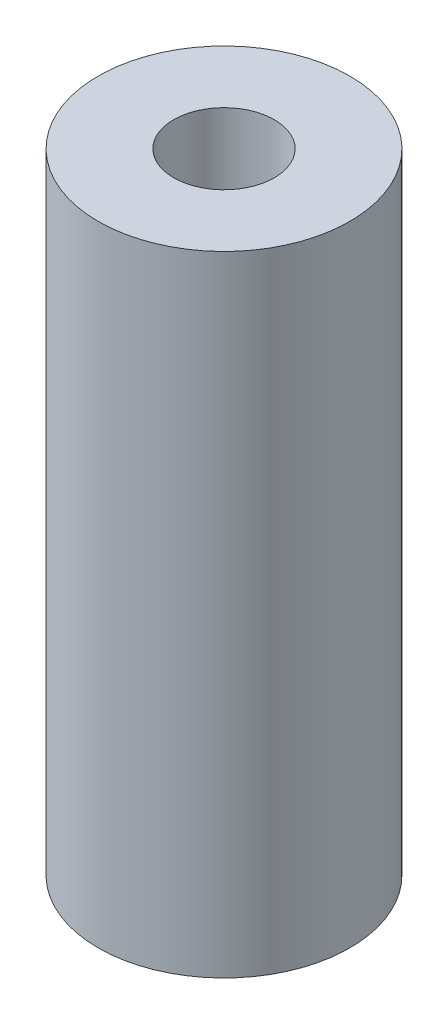
ISO-10303-21;
HEADER;
FILE_DESCRIPTION(('STEP AP214'),'2;1');
FILE_NAME('part.step','',(''),(''),'','','');
FILE_SCHEMA(('AUTOMOTIVE_DESIGN { 1 0 10303 214 1 1 1 1 }'));
ENDSEC;
DATA;
#1=APPLICATION_CONTEXT('core data for automotive mechanical design processes');
#2=APPLICATION_PROTOCOL_DEFINITION('international standard','automotive_design',2000,#1);
#3=PRODUCT_CONTEXT('',#1,'mechanical');
#4=PRODUCT('Part','Part','',(#3));
#5=PRODUCT_RELATED_PRODUCT_CATEGORY('part','',(#4));
#6=PRODUCT_DEFINITION_FORMATION('','',#4);
#7=PRODUCT_DEFINITION_CONTEXT('part definition',#1,'design');
#8=PRODUCT_DEFINITION('design','',#6,#7);
#9=PRODUCT_DEFINITION_SHAPE('','',#8);
#10=(LENGTH_UNIT() NAMED_UNIT(*) SI_UNIT(.MILLI.,.METRE.));
#11=(NAMED_UNIT(*) PLANE_ANGLE_UNIT() SI_UNIT($,.RADIAN.));
#12=(NAMED_UNIT(*) SI_UNIT($,.STERADIAN.) SOLID_ANGLE_UNIT());
#13=UNCERTAINTY_MEASURE_WITH_UNIT(LENGTH_MEASURE(1.E-05),#10,'distance_accuracy_value','');
#14=(GEOMETRIC_REPRESENTATION_CONTEXT(3) GLOBAL_UNCERTAINTY_ASSIGNED_CONTEXT((#13)) GLOBAL_UNIT_ASSIGNED_CONTEXT((#10,
#11,#12)) REPRESENTATION_CONTEXT('',''));
#15=CARTESIAN_POINT('',(0.,0.,0.));
#16=DIRECTION('',(0.,0.,1.));
#17=DIRECTION('',(1.,0.,0.));
#18=AXIS2_PLACEMENT_3D('',#15,#16,#17);
#19=CARTESIAN_POINT('',(0.,12.5,0.));
#20=DIRECTION('',(0.,1.,0.));
#21=DIRECTION('',(0.,0.,1.));
#22=AXIS2_PLACEMENT_3D('',#19,#20,#21);
#23=PLANE('',#22);
#24=CARTESIAN_POINT('',(0.,12.5,0.));
#25=DIRECTION('',(0.,1.,0.));
#26=DIRECTION('',(0.,0.,1.));
#27=AXIS2_PLACEMENT_3D('',#24,#25,#26);
#28=CIRCLE('',#27,2.5);
#29=CARTESIAN_POINT('',(0.,12.5,2.5));
#30=VERTEX_POINT('',#29);
#31=EDGE_CURVE('E10',#30,#30,#28,.T.);
#32=ORIENTED_EDGE('',*,*,#31,.T.);
#33=EDGE_LOOP('',(#32));
#34=FACE_BOUND('',#33,.T.);
#35=CARTESIAN_POINT('',(0.,12.5,0.));
#36=DIRECTION('',(0.,1.,0.));
#37=DIRECTION('',(0.,0.,1.));
#38=AXIS2_PLACEMENT_3D('',#35,#36,#37);
#39=CIRCLE('',#38,1.);
#40=CARTESIAN_POINT('',(0.,12.5,1.));
#41=VERTEX_POINT('',#40);
#42=EDGE_CURVE('E43',#41,#41,#39,.T.);
#43=ORIENTED_EDGE('',*,*,#42,.F.);
#44=EDGE_LOOP('',(#43));
#45=FACE_BOUND('',#44,.T.);
#46=ADVANCED_FACE('F32',(#34,#45),#23,.T.);
#47=CARTESIAN_POINT('',(0.,0.,0.));
#48=DIRECTION('',(0.,1.,0.));
#49=DIRECTION('',(0.,0.,1.));
#50=AXIS2_PLACEMENT_3D('',#47,#48,#49);
#51=PLANE('',#50);
#52=CARTESIAN_POINT('',(0.,0.,0.));
#53=DIRECTION('',(0.,1.,0.));
#54=DIRECTION('',(0.,0.,1.));
#55=AXIS2_PLACEMENT_3D('',#52,#53,#54);
#56=CIRCLE('',#55,2.5);
#57=CARTESIAN_POINT('',(0.,0.,2.5));
#58=VERTEX_POINT('',#57);
#59=EDGE_CURVE('E36',#58,#58,#56,.T.);
#60=ORIENTED_EDGE('',*,*,#59,.F.);
#61=EDGE_LOOP('',(#60));
#62=FACE_BOUND('',#61,.T.);
#63=CARTESIAN_POINT('',(0.,0.,0.));
#64=DIRECTION('',(0.,1.,0.));
#65=DIRECTION('',(0.,0.,1.));
#66=AXIS2_PLACEMENT_3D('',#63,#64,#65);
#67=CIRCLE('',#66,1.);
#68=CARTESIAN_POINT('',(0.,0.,1.));
#69=VERTEX_POINT('',#68);
#70=EDGE_CURVE('E45',#69,#69,#67,.T.);
#71=ORIENTED_EDGE('',*,*,#70,.T.);
#72=EDGE_LOOP('',(#71));
#73=FACE_BOUND('',#72,.T.);
#74=ADVANCED_FACE('F55',(#62,#73),#51,.F.);
#75=CARTESIAN_POINT('',(0.,12.5,0.));
#76=DIRECTION('',(0.,-1.,0.));
#77=DIRECTION('',(0.,0.,-1.));
#78=AXIS2_PLACEMENT_3D('',#75,#76,#77);
#79=CYLINDRICAL_SURFACE('',#78,2.5);
#80=ORIENTED_EDGE('',*,*,#31,.F.);
#81=EDGE_LOOP('',(#80));
#82=FACE_BOUND('',#81,.T.);
#83=ORIENTED_EDGE('',*,*,#59,.T.);
#84=EDGE_LOOP('',(#83));
#85=FACE_BOUND('',#84,.T.);
#86=ADVANCED_FACE('F34',(#82,#85),#79,.T.);
#87=CARTESIAN_POINT('',(0.,12.5,0.));
#88=DIRECTION('',(0.,-1.,0.));
#89=DIRECTION('',(0.,0.,-1.));
#90=AXIS2_PLACEMENT_3D('',#87,#88,#89);
#91=CYLINDRICAL_SURFACE('',#90,1.);
#92=ORIENTED_EDGE('',*,*,#42,.T.);
#93=EDGE_LOOP('',(#92));
#94=FACE_BOUND('',#93,.T.);
#95=ORIENTED_EDGE('',*,*,#70,.F.);
#96=EDGE_LOOP('',(#95));
#97=FACE_BOUND('',#96,.T.);
#98=ADVANCED_FACE('F51',(#94,#97),#91,.F.);
#99=CLOSED_SHELL('',(#46,#74,#86,#98));
#100=MANIFOLD_SOLID_BREP('B2',#99);
#101=ADVANCED_BREP_SHAPE_REPRESENTATION('',(#18,#100),#14);
#102=SHAPE_DEFINITION_REPRESENTATION(#9,#101);
ENDSEC;
END-ISO-10303-21;
